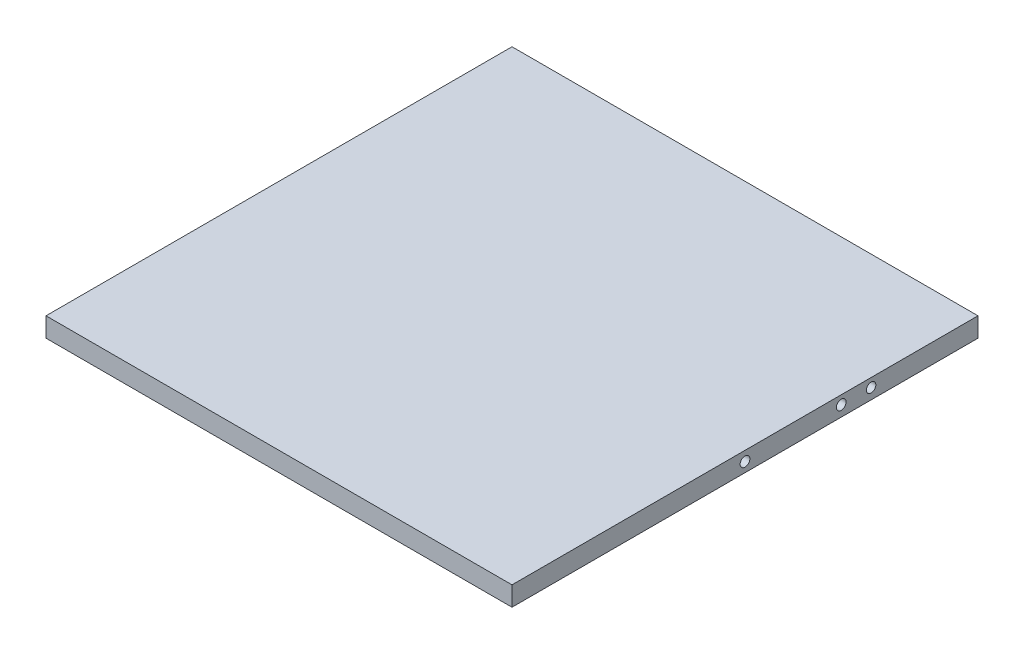
ISO-10303-21;
HEADER;
FILE_DESCRIPTION(('STEP AP214'),'2;1');
FILE_NAME('part.step','',(''),(''),'','','');
FILE_SCHEMA(('AUTOMOTIVE_DESIGN { 1 0 10303 214 1 1 1 1 }'));
ENDSEC;
DATA;
#1=APPLICATION_CONTEXT('core data for automotive mechanical design processes');
#2=APPLICATION_PROTOCOL_DEFINITION('international standard','automotive_design',2000,#1);
#3=PRODUCT_CONTEXT('',#1,'mechanical');
#4=PRODUCT('Part','Part','',(#3));
#5=PRODUCT_RELATED_PRODUCT_CATEGORY('part','',(#4));
#6=PRODUCT_DEFINITION_FORMATION('','',#4);
#7=PRODUCT_DEFINITION_CONTEXT('part definition',#1,'design');
#8=PRODUCT_DEFINITION('design','',#6,#7);
#9=PRODUCT_DEFINITION_SHAPE('','',#8);
#10=(LENGTH_UNIT() NAMED_UNIT(*) SI_UNIT(.MILLI.,.METRE.));
#11=(NAMED_UNIT(*) PLANE_ANGLE_UNIT() SI_UNIT($,.RADIAN.));
#12=(NAMED_UNIT(*) SI_UNIT($,.STERADIAN.) SOLID_ANGLE_UNIT());
#13=UNCERTAINTY_MEASURE_WITH_UNIT(LENGTH_MEASURE(1.E-05),#10,'distance_accuracy_value','');
#14=(GEOMETRIC_REPRESENTATION_CONTEXT(3) GLOBAL_UNCERTAINTY_ASSIGNED_CONTEXT((#13)) GLOBAL_UNIT_ASSIGNED_CONTEXT((#10,
#11,#12)) REPRESENTATION_CONTEXT('',''));
#15=CARTESIAN_POINT('',(0.,0.,0.));
#16=DIRECTION('',(0.,0.,1.));
#17=DIRECTION('',(1.,0.,0.));
#18=AXIS2_PLACEMENT_3D('',#15,#16,#17);
#19=CARTESIAN_POINT('',(-327.04019138756,15.8806316780285,-231.743406411865));
#20=DIRECTION('',(1.,0.,0.));
#21=DIRECTION('',(0.,0.,-1.));
#22=AXIS2_PLACEMENT_3D('',#19,#20,#21);
#23=PLANE('',#22);
#24=CARTESIAN_POINT('',(-327.04019138756,7.37358199689181,-126.861502410377));
#25=DIRECTION('',(1.,0.,0.));
#26=DIRECTION('',(0.,0.,-1.));
#27=AXIS2_PLACEMENT_3D('',#24,#25,#26);
#28=CIRCLE('',#27,4.63437112117284);
#29=CARTESIAN_POINT('',(-327.04019138756,7.37358199689181,-122.227131289204));
#30=VERTEX_POINT('',#29);
#31=EDGE_CURVE('E121',#30,#30,#28,.T.);
#32=ORIENTED_EDGE('',*,*,#31,.T.);
#33=EDGE_LOOP('',(#32));
#34=FACE_BOUND('',#33,.T.);
#35=CARTESIAN_POINT('',(-327.040191387559,7.40702641619722,-97.5740298598318));
#36=DIRECTION('',(-1.,0.,0.));
#37=DIRECTION('',(0.,0.,1.));
#38=AXIS2_PLACEMENT_3D('',#35,#36,#37);
#39=CIRCLE('',#38,4.7625);
#40=CARTESIAN_POINT('',(-327.040191387559,7.40702641619722,-92.8115298598318));
#41=VERTEX_POINT('',#40);
#42=EDGE_CURVE('E118',#41,#41,#39,.T.);
#43=ORIENTED_EDGE('',*,*,#42,.F.);
#44=EDGE_LOOP('',(#43));
#45=FACE_BOUND('',#44,.T.);
#46=CARTESIAN_POINT('',(-327.04019138756,6.35563167802849,-3.14340641186537));
#47=DIRECTION('',(1.,0.,0.));
#48=DIRECTION('',(0.,0.,-1.));
#49=AXIS2_PLACEMENT_3D('',#46,#47,#48);
#50=CIRCLE('',#49,4.7625);
#51=CARTESIAN_POINT('',(-327.04019138756,6.35563167802849,-7.90590641186537));
#52=VERTEX_POINT('',#51);
#53=EDGE_CURVE('E101',#52,#52,#50,.T.);
#54=ORIENTED_EDGE('',*,*,#53,.T.);
#55=EDGE_LOOP('',(#54));
#56=FACE_BOUND('',#55,.T.);
#57=DIRECTION('',(0.,0.,1.));
#58=VECTOR('',#57,1.);
#59=CARTESIAN_POINT('',(-327.04019138756,-3.16936832197151,-231.743406411865));
#60=LINE('',#59,#58);
#61=CARTESIAN_POINT('',(-327.04019138756,-3.16936832197151,-231.743406411865));
#62=VERTEX_POINT('',#61);
#63=CARTESIAN_POINT('',(-327.04019138756,-3.16936832197151,225.456593588135));
#64=VERTEX_POINT('',#63);
#65=EDGE_CURVE('E98',#62,#64,#60,.T.);
#66=ORIENTED_EDGE('',*,*,#65,.T.);
#67=DIRECTION('',(0.,-1.,0.));
#68=VECTOR('',#67,1.);
#69=CARTESIAN_POINT('',(-327.04019138756,15.8806316780285,225.456593588135));
#70=LINE('',#69,#68);
#71=CARTESIAN_POINT('',(-327.04019138756,15.8806316780285,225.456593588135));
#72=VERTEX_POINT('',#71);
#73=EDGE_CURVE('E11',#72,#64,#70,.T.);
#74=ORIENTED_EDGE('',*,*,#73,.F.);
#75=DIRECTION('',(0.,0.,1.));
#76=VECTOR('',#75,1.);
#77=CARTESIAN_POINT('',(-327.04019138756,15.8806316780285,-231.743406411865));
#78=LINE('',#77,#76);
#79=CARTESIAN_POINT('',(-327.04019138756,15.8806316780285,-231.743406411865));
#80=VERTEX_POINT('',#79);
#81=EDGE_CURVE('E86',#80,#72,#78,.T.);
#82=ORIENTED_EDGE('',*,*,#81,.F.);
#83=DIRECTION('',(0.,-1.,0.));
#84=VECTOR('',#83,1.);
#85=CARTESIAN_POINT('',(-327.04019138756,15.8806316780285,-231.743406411865));
#86=LINE('',#85,#84);
#87=EDGE_CURVE('E94',#80,#62,#86,.T.);
#88=ORIENTED_EDGE('',*,*,#87,.T.);
#89=EDGE_LOOP('',(#66,#74,#82,#88));
#90=FACE_BOUND('',#89,.T.);
#91=ADVANCED_FACE('F35',(#34,#45,#56,#90),#23,.F.);
#92=CARTESIAN_POINT('',(-327.04019138756,15.8806316780285,225.456593588135));
#93=DIRECTION('',(0.,0.,-1.));
#94=DIRECTION('',(-1.,0.,0.));
#95=AXIS2_PLACEMENT_3D('',#92,#93,#94);
#96=PLANE('',#95);
#97=DIRECTION('',(1.,0.,0.));
#98=VECTOR('',#97,1.);
#99=CARTESIAN_POINT('',(-327.04019138756,-3.16936832197151,225.456593588135));
#100=LINE('',#99,#98);
#101=CARTESIAN_POINT('',(130.15980861244,-3.16936832197151,225.456593588135));
#102=VERTEX_POINT('',#101);
#103=EDGE_CURVE('E90',#64,#102,#100,.T.);
#104=ORIENTED_EDGE('',*,*,#103,.T.);
#105=DIRECTION('',(0.,-1.,0.));
#106=VECTOR('',#105,1.);
#107=CARTESIAN_POINT('',(130.15980861244,15.8806316780285,225.456593588135));
#108=LINE('',#107,#106);
#109=CARTESIAN_POINT('',(130.15980861244,15.8806316780285,225.456593588135));
#110=VERTEX_POINT('',#109);
#111=EDGE_CURVE('E43',#110,#102,#108,.T.);
#112=ORIENTED_EDGE('',*,*,#111,.F.);
#113=DIRECTION('',(1.,0.,0.));
#114=VECTOR('',#113,1.);
#115=CARTESIAN_POINT('',(-327.04019138756,15.8806316780285,225.456593588135));
#116=LINE('',#115,#114);
#117=EDGE_CURVE('E81',#72,#110,#116,.T.);
#118=ORIENTED_EDGE('',*,*,#117,.F.);
#119=ORIENTED_EDGE('',*,*,#73,.T.);
#120=EDGE_LOOP('',(#104,#112,#118,#119));
#121=FACE_BOUND('',#120,.T.);
#122=ADVANCED_FACE('F89',(#121),#96,.F.);
#123=CARTESIAN_POINT('',(130.15980861244,15.8806316780285,-231.743406411865));
#124=DIRECTION('',(-1.,0.,0.));
#125=DIRECTION('',(0.,0.,1.));
#126=AXIS2_PLACEMENT_3D('',#123,#124,#125);
#127=PLANE('',#126);
#128=CARTESIAN_POINT('',(130.15980861244,7.37358199689181,-126.861502410377));
#129=DIRECTION('',(-1.,0.,0.));
#130=DIRECTION('',(0.,0.,1.));
#131=AXIS2_PLACEMENT_3D('',#128,#129,#130);
#132=CIRCLE('',#131,4.63437112117284);
#133=CARTESIAN_POINT('',(130.15980861244,7.37358199689181,-122.227131289204));
#134=VERTEX_POINT('',#133);
#135=EDGE_CURVE('E126',#134,#134,#132,.T.);
#136=ORIENTED_EDGE('',*,*,#135,.T.);
#137=EDGE_LOOP('',(#136));
#138=FACE_BOUND('',#137,.T.);
#139=CARTESIAN_POINT('',(130.15980861244,7.40702641619722,-97.5740298598318));
#140=DIRECTION('',(-1.,0.,0.));
#141=DIRECTION('',(0.,0.,1.));
#142=AXIS2_PLACEMENT_3D('',#139,#140,#141);
#143=CIRCLE('',#142,4.7625);
#144=CARTESIAN_POINT('',(130.15980861244,7.40702641619722,-92.8115298598318));
#145=VERTEX_POINT('',#144);
#146=EDGE_CURVE('E115',#145,#145,#143,.T.);
#147=ORIENTED_EDGE('',*,*,#146,.T.);
#148=EDGE_LOOP('',(#147));
#149=FACE_BOUND('',#148,.T.);
#150=CARTESIAN_POINT('',(130.15980861244,6.35563167802849,-3.14340641186537));
#151=DIRECTION('',(1.,0.,0.));
#152=DIRECTION('',(0.,0.,-1.));
#153=AXIS2_PLACEMENT_3D('',#150,#151,#152);
#154=CIRCLE('',#153,4.7625);
#155=CARTESIAN_POINT('',(130.15980861244,6.35563167802849,-7.90590641186537));
#156=VERTEX_POINT('',#155);
#157=EDGE_CURVE('E112',#156,#156,#154,.T.);
#158=ORIENTED_EDGE('',*,*,#157,.F.);
#159=EDGE_LOOP('',(#158));
#160=FACE_BOUND('',#159,.T.);
#161=DIRECTION('',(0.,0.,-1.));
#162=VECTOR('',#161,1.);
#163=CARTESIAN_POINT('',(130.15980861244,-3.16936832197151,-231.743406411865));
#164=LINE('',#163,#162);
#165=CARTESIAN_POINT('',(130.15980861244,-3.16936832197151,-231.743406411865));
#166=VERTEX_POINT('',#165);
#167=EDGE_CURVE('E68',#102,#166,#164,.T.);
#168=ORIENTED_EDGE('',*,*,#167,.T.);
#169=DIRECTION('',(0.,-1.,0.));
#170=VECTOR('',#169,1.);
#171=CARTESIAN_POINT('',(130.15980861244,15.8806316780285,-231.743406411865));
#172=LINE('',#171,#170);
#173=CARTESIAN_POINT('',(130.15980861244,15.8806316780285,-231.743406411865));
#174=VERTEX_POINT('',#173);
#175=EDGE_CURVE('E91',#174,#166,#172,.T.);
#176=ORIENTED_EDGE('',*,*,#175,.F.);
#177=DIRECTION('',(0.,0.,-1.));
#178=VECTOR('',#177,1.);
#179=CARTESIAN_POINT('',(130.15980861244,15.8806316780285,-231.743406411865));
#180=LINE('',#179,#178);
#181=EDGE_CURVE('E84',#110,#174,#180,.T.);
#182=ORIENTED_EDGE('',*,*,#181,.F.);
#183=ORIENTED_EDGE('',*,*,#111,.T.);
#184=EDGE_LOOP('',(#168,#176,#182,#183));
#185=FACE_BOUND('',#184,.T.);
#186=ADVANCED_FACE('F92',(#138,#149,#160,#185),#127,.F.);
#187=CARTESIAN_POINT('',(-327.04019138756,15.8806316780285,-231.743406411865));
#188=DIRECTION('',(0.,0.,1.));
#189=DIRECTION('',(1.,0.,0.));
#190=AXIS2_PLACEMENT_3D('',#187,#188,#189);
#191=PLANE('',#190);
#192=DIRECTION('',(-1.,0.,0.));
#193=VECTOR('',#192,1.);
#194=CARTESIAN_POINT('',(-327.04019138756,-3.16936832197151,-231.743406411865));
#195=LINE('',#194,#193);
#196=EDGE_CURVE('E74',#166,#62,#195,.T.);
#197=ORIENTED_EDGE('',*,*,#196,.T.);
#198=ORIENTED_EDGE('',*,*,#87,.F.);
#199=DIRECTION('',(-1.,0.,0.));
#200=VECTOR('',#199,1.);
#201=CARTESIAN_POINT('',(-327.04019138756,15.8806316780285,-231.743406411865));
#202=LINE('',#201,#200);
#203=EDGE_CURVE('E51',#174,#80,#202,.T.);
#204=ORIENTED_EDGE('',*,*,#203,.F.);
#205=ORIENTED_EDGE('',*,*,#175,.T.);
#206=EDGE_LOOP('',(#197,#198,#204,#205));
#207=FACE_BOUND('',#206,.T.);
#208=ADVANCED_FACE('F106',(#207),#191,.F.);
#209=CARTESIAN_POINT('',(49.2200956937799,15.8806316780285,0.684823253206297));
#210=DIRECTION('',(0.,1.,0.));
#211=DIRECTION('',(0.,0.,1.));
#212=AXIS2_PLACEMENT_3D('',#209,#210,#211);
#213=PLANE('',#212);
#214=ORIENTED_EDGE('',*,*,#81,.T.);
#215=ORIENTED_EDGE('',*,*,#117,.T.);
#216=ORIENTED_EDGE('',*,*,#181,.T.);
#217=ORIENTED_EDGE('',*,*,#203,.T.);
#218=EDGE_LOOP('',(#214,#215,#216,#217));
#219=FACE_BOUND('',#218,.T.);
#220=ADVANCED_FACE('F82',(#219),#213,.T.);
#221=CARTESIAN_POINT('',(49.2200956937799,-3.16936832197151,0.684823253206297));
#222=DIRECTION('',(0.,1.,0.));
#223=DIRECTION('',(0.,0.,1.));
#224=AXIS2_PLACEMENT_3D('',#221,#222,#223);
#225=PLANE('',#224);
#226=ORIENTED_EDGE('',*,*,#65,.F.);
#227=ORIENTED_EDGE('',*,*,#196,.F.);
#228=ORIENTED_EDGE('',*,*,#167,.F.);
#229=ORIENTED_EDGE('',*,*,#103,.F.);
#230=EDGE_LOOP('',(#226,#227,#228,#229));
#231=FACE_BOUND('',#230,.T.);
#232=ADVANCED_FACE('F109',(#231),#225,.F.);
#233=CARTESIAN_POINT('',(-327.04019138756,6.35563167802849,-3.14340641186537));
#234=DIRECTION('',(1.,0.,0.));
#235=DIRECTION('',(0.,0.,-1.));
#236=AXIS2_PLACEMENT_3D('',#233,#234,#235);
#237=CYLINDRICAL_SURFACE('',#236,4.7625);
#238=CARTESIAN_POINT('',(-327.04019138756,6.35563167802849,-7.90590641186537));
#239=CARTESIAN_POINT('',(-322.27769138756,6.35563167802849,-7.90590641186537));
#240=CARTESIAN_POINT('',(-317.51519138756,6.35563167802849,-7.90590641186537));
#241=CARTESIAN_POINT('',(-307.99019138756,6.35563167802849,-7.90590641186537));
#242=CARTESIAN_POINT('',(-303.22769138756,6.35563167802849,-7.90590641186537));
#243=CARTESIAN_POINT('',(-293.70269138756,6.35563167802849,-7.90590641186537));
#244=CARTESIAN_POINT('',(-288.94019138756,6.35563167802849,-7.90590641186537));
#245=CARTESIAN_POINT('',(-279.41519138756,6.35563167802849,-7.90590641186537));
#246=CARTESIAN_POINT('',(-274.65269138756,6.35563167802849,-7.90590641186537));
#247=CARTESIAN_POINT('',(-265.12769138756,6.35563167802849,-7.90590641186537));
#248=CARTESIAN_POINT('',(-260.36519138756,6.35563167802849,-7.90590641186537));
#249=CARTESIAN_POINT('',(-250.84019138756,6.35563167802849,-7.90590641186537));
#250=CARTESIAN_POINT('',(-246.07769138756,6.35563167802849,-7.90590641186537));
#251=CARTESIAN_POINT('',(-236.55269138756,6.35563167802849,-7.90590641186537));
#252=CARTESIAN_POINT('',(-231.79019138756,6.35563167802849,-7.90590641186537));
#253=CARTESIAN_POINT('',(-222.26519138756,6.35563167802849,-7.90590641186537));
#254=CARTESIAN_POINT('',(-217.50269138756,6.35563167802849,-7.90590641186537));
#255=CARTESIAN_POINT('',(-207.97769138756,6.35563167802849,-7.90590641186537));
#256=CARTESIAN_POINT('',(-203.21519138756,6.35563167802849,-7.90590641186537));
#257=CARTESIAN_POINT('',(-193.69019138756,6.35563167802849,-7.90590641186537));
#258=CARTESIAN_POINT('',(-188.92769138756,6.35563167802849,-7.90590641186537));
#259=CARTESIAN_POINT('',(-179.40269138756,6.35563167802849,-7.90590641186537));
#260=CARTESIAN_POINT('',(-174.64019138756,6.35563167802849,-7.90590641186537));
#261=CARTESIAN_POINT('',(-165.11519138756,6.35563167802849,-7.90590641186537));
#262=CARTESIAN_POINT('',(-160.35269138756,6.35563167802849,-7.90590641186537));
#263=CARTESIAN_POINT('',(-150.82769138756,6.35563167802849,-7.90590641186537));
#264=CARTESIAN_POINT('',(-146.06519138756,6.35563167802849,-7.90590641186537));
#265=CARTESIAN_POINT('',(-136.54019138756,6.35563167802849,-7.90590641186537));
#266=CARTESIAN_POINT('',(-131.77769138756,6.35563167802849,-7.90590641186537));
#267=CARTESIAN_POINT('',(-122.25269138756,6.35563167802849,-7.90590641186537));
#268=CARTESIAN_POINT('',(-117.49019138756,6.35563167802849,-7.90590641186537));
#269=CARTESIAN_POINT('',(-107.96519138756,6.35563167802849,-7.90590641186537));
#270=CARTESIAN_POINT('',(-103.20269138756,6.35563167802849,-7.90590641186537));
#271=CARTESIAN_POINT('',(-93.6776913875597,6.35563167802849,-7.90590641186537));
#272=CARTESIAN_POINT('',(-88.9151913875597,6.35563167802849,-7.90590641186537));
#273=CARTESIAN_POINT('',(-79.3901913875598,6.35563167802849,-7.90590641186537));
#274=CARTESIAN_POINT('',(-74.6276913875598,6.35563167802849,-7.90590641186537));
#275=CARTESIAN_POINT('',(-65.1026913875598,6.35563167802849,-7.90590641186537));
#276=CARTESIAN_POINT('',(-60.3401913875598,6.35563167802849,-7.90590641186537));
#277=CARTESIAN_POINT('',(-50.8151913875598,6.35563167802849,-7.90590641186537));
#278=CARTESIAN_POINT('',(-46.0526913875598,6.35563167802849,-7.90590641186537));
#279=CARTESIAN_POINT('',(-36.5276913875598,6.35563167802849,-7.90590641186537));
#280=CARTESIAN_POINT('',(-31.7651913875598,6.35563167802849,-7.90590641186537));
#281=CARTESIAN_POINT('',(-22.2401913875598,6.35563167802849,-7.90590641186537));
#282=CARTESIAN_POINT('',(-17.4776913875598,6.35563167802849,-7.90590641186537));
#283=CARTESIAN_POINT('',(-7.95269138755977,6.35563167802849,-7.90590641186537));
#284=CARTESIAN_POINT('',(-3.19019138755977,6.35563167802849,-7.90590641186537));
#285=CARTESIAN_POINT('',(6.33480861244023,6.35563167802849,-7.90590641186537));
#286=CARTESIAN_POINT('',(11.0973086124402,6.35563167802849,-7.90590641186537));
#287=CARTESIAN_POINT('',(20.6223086124402,6.35563167802849,-7.90590641186537));
#288=CARTESIAN_POINT('',(25.3848086124402,6.35563167802849,-7.90590641186537));
#289=CARTESIAN_POINT('',(34.9098086124403,6.35563167802849,-7.90590641186537));
#290=CARTESIAN_POINT('',(39.6723086124403,6.35563167802849,-7.90590641186537));
#291=CARTESIAN_POINT('',(49.1973086124403,6.35563167802849,-7.90590641186537));
#292=CARTESIAN_POINT('',(53.9598086124403,6.35563167802849,-7.90590641186537));
#293=CARTESIAN_POINT('',(63.4848086124403,6.35563167802849,-7.90590641186537));
#294=CARTESIAN_POINT('',(68.2473086124403,6.35563167802849,-7.90590641186537));
#295=CARTESIAN_POINT('',(77.7723086124403,6.35563167802849,-7.90590641186537));
#296=CARTESIAN_POINT('',(82.5348086124403,6.35563167802849,-7.90590641186537));
#297=CARTESIAN_POINT('',(92.0598086124403,6.35563167802849,-7.90590641186537));
#298=CARTESIAN_POINT('',(96.8223086124403,6.35563167802849,-7.90590641186537));
#299=CARTESIAN_POINT('',(106.34730861244,6.35563167802849,-7.90590641186537));
#300=CARTESIAN_POINT('',(111.10980861244,6.35563167802849,-7.90590641186537));
#301=CARTESIAN_POINT('',(120.63480861244,6.35563167802849,-7.90590641186537));
#302=CARTESIAN_POINT('',(125.39730861244,6.35563167802849,-7.90590641186537));
#303=CARTESIAN_POINT('',(130.15980861244,6.35563167802849,-7.90590641186537));
#304=B_SPLINE_CURVE_WITH_KNOTS('',3,(#238,#239,#240,#241,#242,#243,#244,#245,#246,#247,#248,
#249,#250,#251,#252,#253,#254,#255,#256,#257,#258,#259,#260,#261,#262,#263,#264,#265,#266,#267,
#268,#269,#270,#271,#272,#273,#274,#275,#276,#277,#278,#279,#280,#281,#282,#283,#284,#285,#286,
#287,#288,#289,#290,#291,#292,#293,#294,#295,#296,#297,#298,#299,#300,#301,#302,#303),
.UNSPECIFIED.,.F.,.F.,(4,2,2,2,2,2,2,2,2,2,2,2,2,2,2,2,2,2,2,2,2,2,2,2,2,2,2,2,2,2,2,2,4),(0.,
14.2875,28.575,42.8625,57.15,71.4375,85.7250000000001,100.0125,114.3,128.5875,142.875,157.1625,
171.45,185.7375,200.025,214.3125,228.6,242.8875,257.175,271.4625,285.75,300.0375,314.325,
328.6125,342.9,357.1875,371.475,385.7625,400.05,414.3375,428.625,442.9125,457.2),.UNSPECIFIED.);
#305=EDGE_CURVE('BSEAM145',#52,#156,#304,.T.);
#306=ORIENTED_EDGE('',*,*,#53,.F.);
#307=ORIENTED_EDGE('',*,*,#157,.T.);
#308=ORIENTED_EDGE('',*,*,#305,.T.);
#309=ORIENTED_EDGE('',*,*,#305,.F.);
#310=EDGE_LOOP('',(#306,#308,#307,#309));
#311=FACE_BOUND('',#310,.T.);
#312=ADVANCED_FACE('F145',(#311),#237,.F.);
#313=CARTESIAN_POINT('',(130.15980861244,7.40702641619722,-97.5740298598318));
#314=DIRECTION('',(-1.,0.,0.));
#315=DIRECTION('',(0.,0.,1.));
#316=AXIS2_PLACEMENT_3D('',#313,#314,#315);
#317=CYLINDRICAL_SURFACE('',#316,4.7625);
#318=CARTESIAN_POINT('',(130.15980861244,7.40702641619722,-92.8115298598318));
#319=CARTESIAN_POINT('',(125.39730861244,7.40702641619722,-92.8115298598318));
#320=CARTESIAN_POINT('',(120.63480861244,7.40702641619722,-92.8115298598318));
#321=CARTESIAN_POINT('',(111.10980861244,7.40702641619722,-92.8115298598318));
#322=CARTESIAN_POINT('',(106.34730861244,7.40702641619722,-92.8115298598318));
#323=CARTESIAN_POINT('',(96.8223086124403,7.40702641619722,-92.8115298598318));
#324=CARTESIAN_POINT('',(92.0598086124403,7.40702641619722,-92.8115298598318));
#325=CARTESIAN_POINT('',(82.5348086124403,7.40702641619722,-92.8115298598318));
#326=CARTESIAN_POINT('',(77.7723086124403,7.40702641619722,-92.8115298598318));
#327=CARTESIAN_POINT('',(68.2473086124404,7.40702641619722,-92.8115298598318));
#328=CARTESIAN_POINT('',(63.4848086124404,7.40702641619722,-92.8115298598318));
#329=CARTESIAN_POINT('',(53.9598086124404,7.40702641619722,-92.8115298598318));
#330=CARTESIAN_POINT('',(49.1973086124404,7.40702641619722,-92.8115298598318));
#331=CARTESIAN_POINT('',(39.6723086124404,7.40702641619722,-92.8115298598318));
#332=CARTESIAN_POINT('',(34.9098086124404,7.40702641619722,-92.8115298598318));
#333=CARTESIAN_POINT('',(25.3848086124404,7.40702641619722,-92.8115298598318));
#334=CARTESIAN_POINT('',(20.6223086124404,7.40702641619722,-92.8115298598318));
#335=CARTESIAN_POINT('',(11.0973086124404,7.40702641619722,-92.8115298598318));
#336=CARTESIAN_POINT('',(6.33480861244045,7.40702641619722,-92.8115298598318));
#337=CARTESIAN_POINT('',(-3.19019138755954,7.40702641619722,-92.8115298598318));
#338=CARTESIAN_POINT('',(-7.95269138755953,7.40702641619722,-92.8115298598318));
#339=CARTESIAN_POINT('',(-17.4776913875595,7.40702641619722,-92.8115298598318));
#340=CARTESIAN_POINT('',(-22.2401913875595,7.40702641619722,-92.8115298598318));
#341=CARTESIAN_POINT('',(-31.7651913875595,7.40702641619722,-92.8115298598318));
#342=CARTESIAN_POINT('',(-36.5276913875595,7.40702641619722,-92.8115298598318));
#343=CARTESIAN_POINT('',(-46.0526913875595,7.40702641619722,-92.8115298598318));
#344=CARTESIAN_POINT('',(-50.8151913875595,7.40702641619722,-92.8115298598318));
#345=CARTESIAN_POINT('',(-60.3401913875595,7.40702641619722,-92.8115298598318));
#346=CARTESIAN_POINT('',(-65.1026913875595,7.40702641619722,-92.8115298598318));
#347=CARTESIAN_POINT('',(-74.6276913875595,7.40702641619722,-92.8115298598318));
#348=CARTESIAN_POINT('',(-79.3901913875595,7.40702641619722,-92.8115298598318));
#349=CARTESIAN_POINT('',(-88.9151913875594,7.40702641619722,-92.8115298598318));
#350=CARTESIAN_POINT('',(-93.6776913875594,7.40702641619722,-92.8115298598318));
#351=CARTESIAN_POINT('',(-103.202691387559,7.40702641619722,-92.8115298598318));
#352=CARTESIAN_POINT('',(-107.965191387559,7.40702641619722,-92.8115298598318));
#353=CARTESIAN_POINT('',(-117.490191387559,7.40702641619722,-92.8115298598318));
#354=CARTESIAN_POINT('',(-122.252691387559,7.40702641619722,-92.8115298598318));
#355=CARTESIAN_POINT('',(-131.777691387559,7.40702641619722,-92.8115298598318));
#356=CARTESIAN_POINT('',(-136.540191387559,7.40702641619722,-92.8115298598318));
#357=CARTESIAN_POINT('',(-146.065191387559,7.40702641619722,-92.8115298598318));
#358=CARTESIAN_POINT('',(-150.827691387559,7.40702641619722,-92.8115298598318));
#359=CARTESIAN_POINT('',(-160.352691387559,7.40702641619722,-92.8115298598318));
#360=CARTESIAN_POINT('',(-165.115191387559,7.40702641619722,-92.8115298598318));
#361=CARTESIAN_POINT('',(-174.640191387559,7.40702641619722,-92.8115298598318));
#362=CARTESIAN_POINT('',(-179.402691387559,7.40702641619722,-92.8115298598318));
#363=CARTESIAN_POINT('',(-188.927691387559,7.40702641619722,-92.8115298598318));
#364=CARTESIAN_POINT('',(-193.690191387559,7.40702641619722,-92.8115298598318));
#365=CARTESIAN_POINT('',(-203.215191387559,7.40702641619722,-92.8115298598318));
#366=CARTESIAN_POINT('',(-207.977691387559,7.40702641619722,-92.8115298598318));
#367=CARTESIAN_POINT('',(-217.502691387559,7.40702641619722,-92.8115298598318));
#368=CARTESIAN_POINT('',(-222.265191387559,7.40702641619722,-92.8115298598318));
#369=CARTESIAN_POINT('',(-231.790191387559,7.40702641619722,-92.8115298598318));
#370=CARTESIAN_POINT('',(-236.552691387559,7.40702641619722,-92.8115298598318));
#371=CARTESIAN_POINT('',(-246.077691387559,7.40702641619722,-92.8115298598318));
#372=CARTESIAN_POINT('',(-250.840191387559,7.40702641619722,-92.8115298598318));
#373=CARTESIAN_POINT('',(-260.365191387559,7.40702641619722,-92.8115298598318));
#374=CARTESIAN_POINT('',(-265.127691387559,7.40702641619722,-92.8115298598318));
#375=CARTESIAN_POINT('',(-274.652691387559,7.40702641619722,-92.8115298598318));
#376=CARTESIAN_POINT('',(-279.415191387559,7.40702641619722,-92.8115298598318));
#377=CARTESIAN_POINT('',(-288.940191387559,7.40702641619722,-92.8115298598318));
#378=CARTESIAN_POINT('',(-293.702691387559,7.40702641619722,-92.8115298598318));
#379=CARTESIAN_POINT('',(-303.227691387559,7.40702641619722,-92.8115298598318));
#380=CARTESIAN_POINT('',(-307.990191387559,7.40702641619722,-92.8115298598318));
#381=CARTESIAN_POINT('',(-317.515191387559,7.40702641619722,-92.8115298598318));
#382=CARTESIAN_POINT('',(-322.277691387559,7.40702641619722,-92.8115298598318));
#383=CARTESIAN_POINT('',(-327.040191387559,7.40702641619722,-92.8115298598318));
#384=B_SPLINE_CURVE_WITH_KNOTS('',3,(#318,#319,#320,#321,#322,#323,#324,#325,#326,#327,#328,
#329,#330,#331,#332,#333,#334,#335,#336,#337,#338,#339,#340,#341,#342,#343,#344,#345,#346,#347,
#348,#349,#350,#351,#352,#353,#354,#355,#356,#357,#358,#359,#360,#361,#362,#363,#364,#365,#366,
#367,#368,#369,#370,#371,#372,#373,#374,#375,#376,#377,#378,#379,#380,#381,#382,#383),
.UNSPECIFIED.,.F.,.F.,(4,2,2,2,2,2,2,2,2,2,2,2,2,2,2,2,2,2,2,2,2,2,2,2,2,2,2,2,2,2,2,2,4),(0.,
14.2875,28.5749999999999,42.8624999999999,57.1499999999999,71.4374999999999,85.7249999999999,
100.0125,114.3,128.5875,142.875,157.1625,171.45,185.7375,200.025,214.3125,228.6,242.8875,
257.175,271.4625,285.75,300.0375,314.325,328.6125,342.9,357.1875,371.475,385.762499999999,
400.049999999999,414.337499999999,428.624999999999,442.912499999999,457.199999999999),.UNSPECIFIED.);
#385=EDGE_CURVE('BSEAM135',#145,#41,#384,.T.);
#386=ORIENTED_EDGE('',*,*,#146,.F.);
#387=ORIENTED_EDGE('',*,*,#42,.T.);
#388=ORIENTED_EDGE('',*,*,#385,.T.);
#389=ORIENTED_EDGE('',*,*,#385,.F.);
#390=EDGE_LOOP('',(#386,#388,#387,#389));
#391=FACE_BOUND('',#390,.T.);
#392=ADVANCED_FACE('F135',(#391),#317,.F.);
#393=CARTESIAN_POINT('',(130.15980861244,7.37358199689181,-126.861502410377));
#394=DIRECTION('',(-1.,0.,0.));
#395=DIRECTION('',(0.,0.,1.));
#396=AXIS2_PLACEMENT_3D('',#393,#394,#395);
#397=CYLINDRICAL_SURFACE('',#396,4.63437112117284);
#398=CARTESIAN_POINT('',(130.15980861244,7.37358199689181,-122.227131289204));
#399=CARTESIAN_POINT('',(125.39730861244,7.37358199689181,-122.227131289204));
#400=CARTESIAN_POINT('',(120.63480861244,7.37358199689181,-122.227131289204));
#401=CARTESIAN_POINT('',(111.10980861244,7.37358199689181,-122.227131289204));
#402=CARTESIAN_POINT('',(106.34730861244,7.37358199689181,-122.227131289204));
#403=CARTESIAN_POINT('',(96.8223086124403,7.37358199689181,-122.227131289204));
#404=CARTESIAN_POINT('',(92.0598086124403,7.37358199689181,-122.227131289204));
#405=CARTESIAN_POINT('',(82.5348086124403,7.37358199689181,-122.227131289204));
#406=CARTESIAN_POINT('',(77.7723086124403,7.37358199689181,-122.227131289204));
#407=CARTESIAN_POINT('',(68.2473086124403,7.37358199689181,-122.227131289204));
#408=CARTESIAN_POINT('',(63.4848086124403,7.37358199689181,-122.227131289204));
#409=CARTESIAN_POINT('',(53.9598086124403,7.37358199689181,-122.227131289204));
#410=CARTESIAN_POINT('',(49.1973086124403,7.37358199689181,-122.227131289204));
#411=CARTESIAN_POINT('',(39.6723086124403,7.37358199689181,-122.227131289204));
#412=CARTESIAN_POINT('',(34.9098086124403,7.37358199689181,-122.227131289204));
#413=CARTESIAN_POINT('',(25.3848086124403,7.37358199689181,-122.227131289204));
#414=CARTESIAN_POINT('',(20.6223086124403,7.37358199689181,-122.227131289204));
#415=CARTESIAN_POINT('',(11.0973086124403,7.37358199689181,-122.227131289204));
#416=CARTESIAN_POINT('',(6.33480861244026,7.37358199689181,-122.227131289204));
#417=CARTESIAN_POINT('',(-3.19019138755974,7.37358199689181,-122.227131289204));
#418=CARTESIAN_POINT('',(-7.95269138755975,7.37358199689181,-122.227131289204));
#419=CARTESIAN_POINT('',(-17.4776913875598,7.37358199689181,-122.227131289204));
#420=CARTESIAN_POINT('',(-22.2401913875598,7.37358199689181,-122.227131289204));
#421=CARTESIAN_POINT('',(-31.7651913875598,7.37358199689181,-122.227131289204));
#422=CARTESIAN_POINT('',(-36.5276913875597,7.37358199689181,-122.227131289204));
#423=CARTESIAN_POINT('',(-46.0526913875597,7.37358199689181,-122.227131289204));
#424=CARTESIAN_POINT('',(-50.8151913875597,7.37358199689181,-122.227131289204));
#425=CARTESIAN_POINT('',(-60.3401913875597,7.37358199689181,-122.227131289204));
#426=CARTESIAN_POINT('',(-65.1026913875598,7.37358199689181,-122.227131289204));
#427=CARTESIAN_POINT('',(-74.6276913875598,7.37358199689181,-122.227131289204));
#428=CARTESIAN_POINT('',(-79.3901913875598,7.37358199689181,-122.227131289204));
#429=CARTESIAN_POINT('',(-88.9151913875598,7.37358199689181,-122.227131289204));
#430=CARTESIAN_POINT('',(-93.6776913875598,7.37358199689181,-122.227131289204));
#431=CARTESIAN_POINT('',(-103.20269138756,7.37358199689181,-122.227131289204));
#432=CARTESIAN_POINT('',(-107.96519138756,7.37358199689181,-122.227131289204));
#433=CARTESIAN_POINT('',(-117.49019138756,7.37358199689181,-122.227131289204));
#434=CARTESIAN_POINT('',(-122.25269138756,7.37358199689181,-122.227131289204));
#435=CARTESIAN_POINT('',(-131.77769138756,7.37358199689181,-122.227131289204));
#436=CARTESIAN_POINT('',(-136.54019138756,7.37358199689181,-122.227131289204));
#437=CARTESIAN_POINT('',(-146.06519138756,7.37358199689181,-122.227131289204));
#438=CARTESIAN_POINT('',(-150.82769138756,7.37358199689181,-122.227131289204));
#439=CARTESIAN_POINT('',(-160.35269138756,7.37358199689181,-122.227131289204));
#440=CARTESIAN_POINT('',(-165.11519138756,7.37358199689181,-122.227131289204));
#441=CARTESIAN_POINT('',(-174.64019138756,7.37358199689181,-122.227131289204));
#442=CARTESIAN_POINT('',(-179.40269138756,7.37358199689181,-122.227131289204));
#443=CARTESIAN_POINT('',(-188.92769138756,7.37358199689181,-122.227131289204));
#444=CARTESIAN_POINT('',(-193.69019138756,7.37358199689181,-122.227131289204));
#445=CARTESIAN_POINT('',(-203.21519138756,7.37358199689181,-122.227131289204));
#446=CARTESIAN_POINT('',(-207.97769138756,7.37358199689181,-122.227131289204));
#447=CARTESIAN_POINT('',(-217.50269138756,7.37358199689181,-122.227131289204));
#448=CARTESIAN_POINT('',(-222.26519138756,7.37358199689181,-122.227131289204));
#449=CARTESIAN_POINT('',(-231.79019138756,7.37358199689181,-122.227131289204));
#450=CARTESIAN_POINT('',(-236.55269138756,7.37358199689181,-122.227131289204));
#451=CARTESIAN_POINT('',(-246.07769138756,7.37358199689181,-122.227131289204));
#452=CARTESIAN_POINT('',(-250.84019138756,7.37358199689181,-122.227131289204));
#453=CARTESIAN_POINT('',(-260.36519138756,7.37358199689181,-122.227131289204));
#454=CARTESIAN_POINT('',(-265.12769138756,7.37358199689181,-122.227131289204));
#455=CARTESIAN_POINT('',(-274.65269138756,7.37358199689181,-122.227131289204));
#456=CARTESIAN_POINT('',(-279.41519138756,7.37358199689181,-122.227131289204));
#457=CARTESIAN_POINT('',(-288.94019138756,7.37358199689181,-122.227131289204));
#458=CARTESIAN_POINT('',(-293.70269138756,7.37358199689181,-122.227131289204));
#459=CARTESIAN_POINT('',(-303.22769138756,7.37358199689181,-122.227131289204));
#460=CARTESIAN_POINT('',(-307.99019138756,7.37358199689181,-122.227131289204));
#461=CARTESIAN_POINT('',(-317.51519138756,7.37358199689181,-122.227131289204));
#462=CARTESIAN_POINT('',(-322.27769138756,7.37358199689181,-122.227131289204));
#463=CARTESIAN_POINT('',(-327.04019138756,7.37358199689181,-122.227131289204));
#464=B_SPLINE_CURVE_WITH_KNOTS('',3,(#398,#399,#400,#401,#402,#403,#404,#405,#406,#407,#408,
#409,#410,#411,#412,#413,#414,#415,#416,#417,#418,#419,#420,#421,#422,#423,#424,#425,#426,#427,
#428,#429,#430,#431,#432,#433,#434,#435,#436,#437,#438,#439,#440,#441,#442,#443,#444,#445,#446,
#447,#448,#449,#450,#451,#452,#453,#454,#455,#456,#457,#458,#459,#460,#461,#462,#463),
.UNSPECIFIED.,.F.,.F.,(4,2,2,2,2,2,2,2,2,2,2,2,2,2,2,2,2,2,2,2,2,2,2,2,2,2,2,2,2,2,2,2,4),(0.,
14.2875,28.575,42.8625,57.15,71.4375,85.725,100.0125,114.3,128.5875,142.875,157.1625,171.45,
185.7375,200.025,214.3125,228.6,242.8875,257.175,271.4625,285.75,300.0375,314.325,328.6125,
342.9,357.1875,371.475,385.7625,400.05,414.3375,428.625,442.9125,457.2),.UNSPECIFIED.);
#465=EDGE_CURVE('BSEAM132',#134,#30,#464,.T.);
#466=ORIENTED_EDGE('',*,*,#135,.F.);
#467=ORIENTED_EDGE('',*,*,#31,.F.);
#468=ORIENTED_EDGE('',*,*,#465,.T.);
#469=ORIENTED_EDGE('',*,*,#465,.F.);
#470=EDGE_LOOP('',(#466,#468,#467,#469));
#471=FACE_BOUND('',#470,.T.);
#472=ADVANCED_FACE('F132',(#471),#397,.F.);
#473=CLOSED_SHELL('',(#91,#122,#186,#208,#220,#232,#312,#392,#472));
#474=MANIFOLD_SOLID_BREP('B2',#473);
#475=ADVANCED_BREP_SHAPE_REPRESENTATION('',(#18,#474),#14);
#476=SHAPE_DEFINITION_REPRESENTATION(#9,#475);
ENDSEC;
END-ISO-10303-21;
